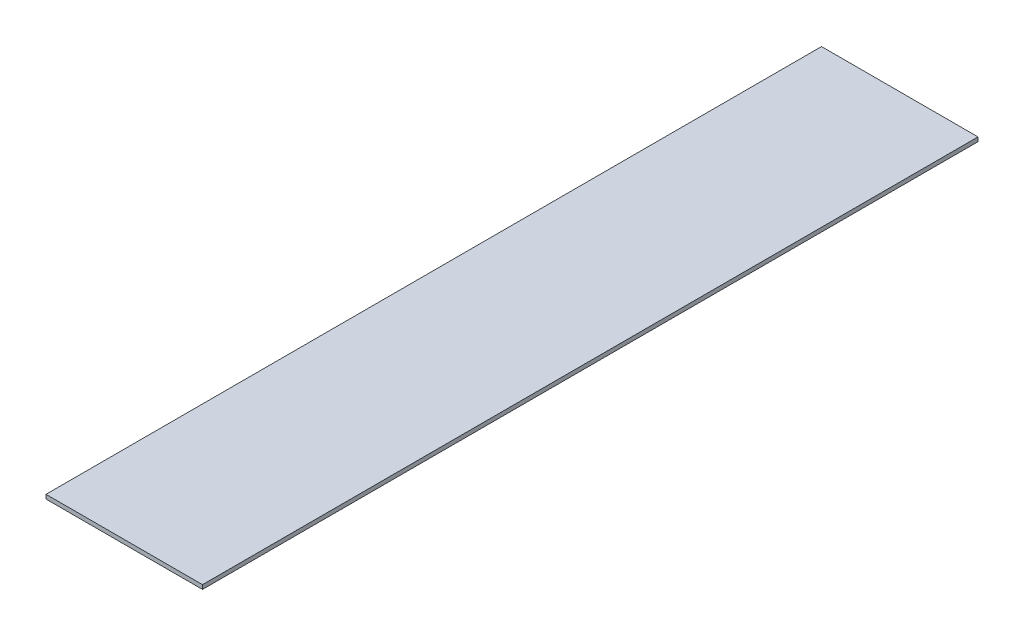
ISO-10303-21;
HEADER;
FILE_DESCRIPTION(('STEP AP214'),'2;1');
FILE_NAME('part.step','',(''),(''),'','','');
FILE_SCHEMA(('AUTOMOTIVE_DESIGN { 1 0 10303 214 1 1 1 1 }'));
ENDSEC;
DATA;
#1=APPLICATION_CONTEXT('core data for automotive mechanical design processes');
#2=APPLICATION_PROTOCOL_DEFINITION('international standard','automotive_design',2000,#1);
#3=PRODUCT_CONTEXT('',#1,'mechanical');
#4=PRODUCT('Part','Part','',(#3));
#5=PRODUCT_RELATED_PRODUCT_CATEGORY('part','',(#4));
#6=PRODUCT_DEFINITION_FORMATION('','',#4);
#7=PRODUCT_DEFINITION_CONTEXT('part definition',#1,'design');
#8=PRODUCT_DEFINITION('design','',#6,#7);
#9=PRODUCT_DEFINITION_SHAPE('','',#8);
#10=(LENGTH_UNIT() NAMED_UNIT(*) SI_UNIT(.MILLI.,.METRE.));
#11=(NAMED_UNIT(*) PLANE_ANGLE_UNIT() SI_UNIT($,.RADIAN.));
#12=(NAMED_UNIT(*) SI_UNIT($,.STERADIAN.) SOLID_ANGLE_UNIT());
#13=UNCERTAINTY_MEASURE_WITH_UNIT(LENGTH_MEASURE(1.E-05),#10,'distance_accuracy_value','');
#14=(GEOMETRIC_REPRESENTATION_CONTEXT(3) GLOBAL_UNCERTAINTY_ASSIGNED_CONTEXT((#13)) GLOBAL_UNIT_ASSIGNED_CONTEXT((#10,
#11,#12)) REPRESENTATION_CONTEXT('',''));
#15=CARTESIAN_POINT('',(0.,0.,0.));
#16=DIRECTION('',(0.,0.,1.));
#17=DIRECTION('',(1.,0.,0.));
#18=AXIS2_PLACEMENT_3D('',#15,#16,#17);
#19=CARTESIAN_POINT('',(0.,3.,0.));
#20=DIRECTION('',(1.,0.,0.));
#21=DIRECTION('',(0.,0.,-1.));
#22=AXIS2_PLACEMENT_3D('',#19,#20,#21);
#23=PLANE('',#22);
#24=DIRECTION('',(0.,0.,1.));
#25=VECTOR('',#24,1.);
#26=CARTESIAN_POINT('',(0.,0.,0.));
#27=LINE('',#26,#25);
#28=CARTESIAN_POINT('',(0.,0.,-560.));
#29=VERTEX_POINT('',#28);
#30=CARTESIAN_POINT('',(0.,0.,0.));
#31=VERTEX_POINT('',#30);
#32=EDGE_CURVE('E95',#29,#31,#27,.T.);
#33=ORIENTED_EDGE('',*,*,#32,.T.);
#34=DIRECTION('',(0.,-1.,0.));
#35=VECTOR('',#34,1.);
#36=CARTESIAN_POINT('',(0.,3.,0.));
#37=LINE('',#36,#35);
#38=CARTESIAN_POINT('',(0.,3.,0.));
#39=VERTEX_POINT('',#38);
#40=EDGE_CURVE('E11',#39,#31,#37,.T.);
#41=ORIENTED_EDGE('',*,*,#40,.F.);
#42=DIRECTION('',(0.,0.,1.));
#43=VECTOR('',#42,1.);
#44=CARTESIAN_POINT('',(0.,3.,0.));
#45=LINE('',#44,#43);
#46=CARTESIAN_POINT('',(0.,3.,-560.));
#47=VERTEX_POINT('',#46);
#48=EDGE_CURVE('E83',#47,#39,#45,.T.);
#49=ORIENTED_EDGE('',*,*,#48,.F.);
#50=DIRECTION('',(0.,-1.,0.));
#51=VECTOR('',#50,1.);
#52=CARTESIAN_POINT('',(0.,3.,-560.));
#53=LINE('',#52,#51);
#54=EDGE_CURVE('E91',#47,#29,#53,.T.);
#55=ORIENTED_EDGE('',*,*,#54,.T.);
#56=EDGE_LOOP('',(#33,#41,#49,#55));
#57=FACE_BOUND('',#56,.T.);
#58=ADVANCED_FACE('F32',(#57),#23,.F.);
#59=CARTESIAN_POINT('',(0.,3.,0.));
#60=DIRECTION('',(0.,0.,-1.));
#61=DIRECTION('',(-1.,0.,0.));
#62=AXIS2_PLACEMENT_3D('',#59,#60,#61);
#63=PLANE('',#62);
#64=DIRECTION('',(1.,0.,0.));
#65=VECTOR('',#64,1.);
#66=CARTESIAN_POINT('',(0.,0.,0.));
#67=LINE('',#66,#65);
#68=CARTESIAN_POINT('',(113.,0.,0.));
#69=VERTEX_POINT('',#68);
#70=EDGE_CURVE('E87',#31,#69,#67,.T.);
#71=ORIENTED_EDGE('',*,*,#70,.T.);
#72=DIRECTION('',(0.,-1.,0.));
#73=VECTOR('',#72,1.);
#74=CARTESIAN_POINT('',(113.,3.,0.));
#75=LINE('',#74,#73);
#76=CARTESIAN_POINT('',(113.,3.,0.));
#77=VERTEX_POINT('',#76);
#78=EDGE_CURVE('E40',#77,#69,#75,.T.);
#79=ORIENTED_EDGE('',*,*,#78,.F.);
#80=DIRECTION('',(1.,0.,0.));
#81=VECTOR('',#80,1.);
#82=CARTESIAN_POINT('',(0.,3.,0.));
#83=LINE('',#82,#81);
#84=EDGE_CURVE('E78',#39,#77,#83,.T.);
#85=ORIENTED_EDGE('',*,*,#84,.F.);
#86=ORIENTED_EDGE('',*,*,#40,.T.);
#87=EDGE_LOOP('',(#71,#79,#85,#86));
#88=FACE_BOUND('',#87,.T.);
#89=ADVANCED_FACE('F86',(#88),#63,.F.);
#90=CARTESIAN_POINT('',(113.,3.,0.));
#91=DIRECTION('',(-1.,0.,0.));
#92=DIRECTION('',(0.,0.,1.));
#93=AXIS2_PLACEMENT_3D('',#90,#91,#92);
#94=PLANE('',#93);
#95=DIRECTION('',(0.,0.,-1.));
#96=VECTOR('',#95,1.);
#97=CARTESIAN_POINT('',(113.,0.,0.));
#98=LINE('',#97,#96);
#99=CARTESIAN_POINT('',(113.,0.,-560.));
#100=VERTEX_POINT('',#99);
#101=EDGE_CURVE('E65',#69,#100,#98,.T.);
#102=ORIENTED_EDGE('',*,*,#101,.T.);
#103=DIRECTION('',(0.,-1.,0.));
#104=VECTOR('',#103,1.);
#105=CARTESIAN_POINT('',(113.,3.,-560.));
#106=LINE('',#105,#104);
#107=CARTESIAN_POINT('',(113.,3.,-560.));
#108=VERTEX_POINT('',#107);
#109=EDGE_CURVE('E88',#108,#100,#106,.T.);
#110=ORIENTED_EDGE('',*,*,#109,.F.);
#111=DIRECTION('',(0.,0.,-1.));
#112=VECTOR('',#111,1.);
#113=CARTESIAN_POINT('',(113.,3.,0.));
#114=LINE('',#113,#112);
#115=EDGE_CURVE('E81',#77,#108,#114,.T.);
#116=ORIENTED_EDGE('',*,*,#115,.F.);
#117=ORIENTED_EDGE('',*,*,#78,.T.);
#118=EDGE_LOOP('',(#102,#110,#116,#117));
#119=FACE_BOUND('',#118,.T.);
#120=ADVANCED_FACE('F89',(#119),#94,.F.);
#121=CARTESIAN_POINT('',(0.,3.,-560.));
#122=DIRECTION('',(0.,0.,1.));
#123=DIRECTION('',(1.,0.,0.));
#124=AXIS2_PLACEMENT_3D('',#121,#122,#123);
#125=PLANE('',#124);
#126=DIRECTION('',(-1.,0.,0.));
#127=VECTOR('',#126,1.);
#128=CARTESIAN_POINT('',(0.,0.,-560.));
#129=LINE('',#128,#127);
#130=EDGE_CURVE('E71',#100,#29,#129,.T.);
#131=ORIENTED_EDGE('',*,*,#130,.T.);
#132=ORIENTED_EDGE('',*,*,#54,.F.);
#133=DIRECTION('',(-1.,0.,0.));
#134=VECTOR('',#133,1.);
#135=CARTESIAN_POINT('',(0.,3.,-560.));
#136=LINE('',#135,#134);
#137=EDGE_CURVE('E48',#108,#47,#136,.T.);
#138=ORIENTED_EDGE('',*,*,#137,.F.);
#139=ORIENTED_EDGE('',*,*,#109,.T.);
#140=EDGE_LOOP('',(#131,#132,#138,#139));
#141=FACE_BOUND('',#140,.T.);
#142=ADVANCED_FACE('F102',(#141),#125,.F.);
#143=CARTESIAN_POINT('',(0.,3.,0.));
#144=DIRECTION('',(0.,-1.,0.));
#145=DIRECTION('',(0.,0.,-1.));
#146=AXIS2_PLACEMENT_3D('',#143,#144,#145);
#147=PLANE('',#146);
#148=ORIENTED_EDGE('',*,*,#48,.T.);
#149=ORIENTED_EDGE('',*,*,#84,.T.);
#150=ORIENTED_EDGE('',*,*,#115,.T.);
#151=ORIENTED_EDGE('',*,*,#137,.T.);
#152=EDGE_LOOP('',(#148,#149,#150,#151));
#153=FACE_BOUND('',#152,.T.);
#154=ADVANCED_FACE('F79',(#153),#147,.F.);
#155=CARTESIAN_POINT('',(0.,0.,0.));
#156=DIRECTION('',(0.,-1.,0.));
#157=DIRECTION('',(0.,0.,-1.));
#158=AXIS2_PLACEMENT_3D('',#155,#156,#157);
#159=PLANE('',#158);
#160=ORIENTED_EDGE('',*,*,#32,.F.);
#161=ORIENTED_EDGE('',*,*,#130,.F.);
#162=ORIENTED_EDGE('',*,*,#101,.F.);
#163=ORIENTED_EDGE('',*,*,#70,.F.);
#164=EDGE_LOOP('',(#160,#161,#162,#163));
#165=FACE_BOUND('',#164,.T.);
#166=ADVANCED_FACE('F105',(#165),#159,.T.);
#167=CLOSED_SHELL('',(#58,#89,#120,#142,#154,#166));
#168=MANIFOLD_SOLID_BREP('B2',#167);
#169=ADVANCED_BREP_SHAPE_REPRESENTATION('',(#18,#168),#14);
#170=SHAPE_DEFINITION_REPRESENTATION(#9,#169);
ENDSEC;
END-ISO-10303-21;
